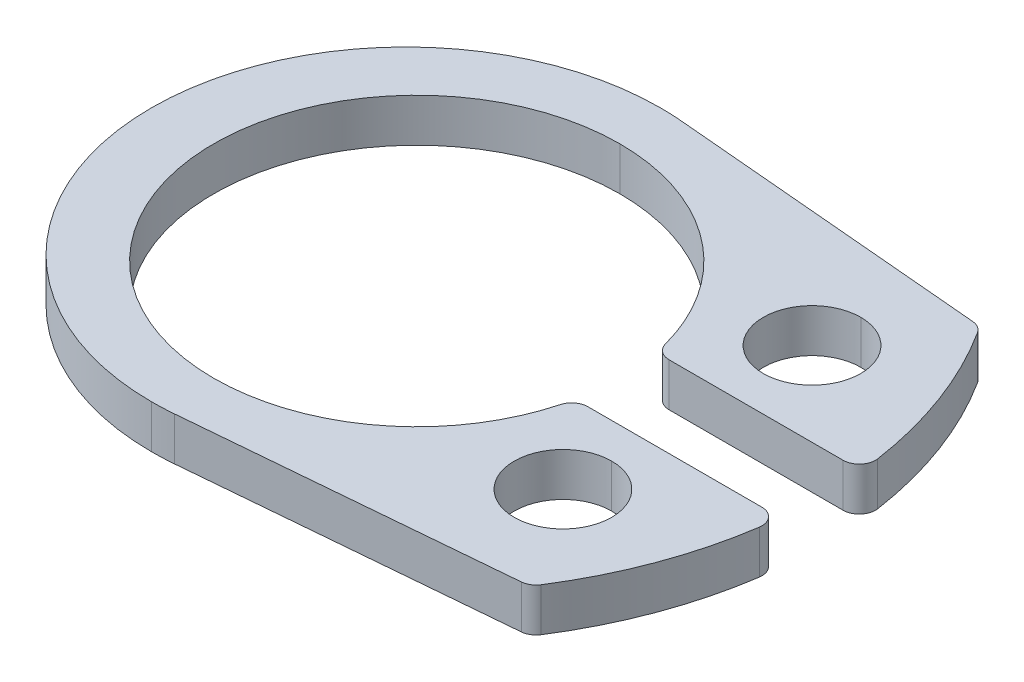
ISO-10303-21;
HEADER;
FILE_DESCRIPTION(('STEP AP214'),'2;1');
FILE_NAME('part.step','',(''),(''),'','','');
FILE_SCHEMA(('AUTOMOTIVE_DESIGN { 1 0 10303 214 1 1 1 1 }'));
ENDSEC;
DATA;
#1=APPLICATION_CONTEXT('core data for automotive mechanical design processes');
#2=APPLICATION_PROTOCOL_DEFINITION('international standard','automotive_design',2000,#1);
#3=PRODUCT_CONTEXT('',#1,'mechanical');
#4=PRODUCT('Part','Part','',(#3));
#5=PRODUCT_RELATED_PRODUCT_CATEGORY('part','',(#4));
#6=PRODUCT_DEFINITION_FORMATION('','',#4);
#7=PRODUCT_DEFINITION_CONTEXT('part definition',#1,'design');
#8=PRODUCT_DEFINITION('design','',#6,#7);
#9=PRODUCT_DEFINITION_SHAPE('','',#8);
#10=(LENGTH_UNIT() NAMED_UNIT(*) SI_UNIT(.MILLI.,.METRE.));
#11=(NAMED_UNIT(*) PLANE_ANGLE_UNIT() SI_UNIT($,.RADIAN.));
#12=(NAMED_UNIT(*) SI_UNIT($,.STERADIAN.) SOLID_ANGLE_UNIT());
#13=UNCERTAINTY_MEASURE_WITH_UNIT(LENGTH_MEASURE(1.E-05),#10,'distance_accuracy_value','');
#14=(GEOMETRIC_REPRESENTATION_CONTEXT(3) GLOBAL_UNCERTAINTY_ASSIGNED_CONTEXT((#13)) GLOBAL_UNIT_ASSIGNED_CONTEXT((#10,
#11,#12)) REPRESENTATION_CONTEXT('',''));
#15=CARTESIAN_POINT('',(0.,0.,0.));
#16=DIRECTION('',(0.,0.,1.));
#17=DIRECTION('',(1.,0.,0.));
#18=AXIS2_PLACEMENT_3D('',#15,#16,#17);
#19=CARTESIAN_POINT('',(7.12302604235026,0.8,-1.05));
#20=DIRECTION('',(0.,-1.,0.));
#21=DIRECTION('',(0.,0.,-1.));
#22=AXIS2_PLACEMENT_3D('',#19,#20,#21);
#23=CYLINDRICAL_SURFACE('',#22,0.3);
#24=CARTESIAN_POINT('',(7.12302604235026,0.8,-1.05));
#25=DIRECTION('',(0.,1.,0.));
#26=DIRECTION('',(0.,0.,1.));
#27=AXIS2_PLACEMENT_3D('',#24,#25,#26);
#28=CIRCLE('',#27,0.3);
#29=CARTESIAN_POINT('',(7.12302604235026,0.8,-0.75));
#30=VERTEX_POINT('',#29);
#31=CARTESIAN_POINT('',(7.41981879411485,0.8,-1.09375));
#32=VERTEX_POINT('',#31);
#33=EDGE_CURVE('E232',#30,#32,#28,.T.);
#34=ORIENTED_EDGE('',*,*,#33,.F.);
#35=DIRECTION('',(0.,1.,0.));
#36=VECTOR('',#35,1.);
#37=CARTESIAN_POINT('',(7.12302604235026,0.8,-0.75));
#38=LINE('',#37,#36);
#39=CARTESIAN_POINT('',(7.12302604235026,0.,-0.75));
#40=VERTEX_POINT('',#39);
#41=EDGE_CURVE('E248',#40,#30,#38,.T.);
#42=ORIENTED_EDGE('',*,*,#41,.F.);
#43=CARTESIAN_POINT('',(7.12302604235026,0.,-1.05));
#44=DIRECTION('',(0.,-1.,0.));
#45=DIRECTION('',(0.,0.,1.));
#46=AXIS2_PLACEMENT_3D('',#43,#44,#45);
#47=CIRCLE('',#46,0.3);
#48=CARTESIAN_POINT('',(7.41981879411485,0.,-1.09375));
#49=VERTEX_POINT('',#48);
#50=EDGE_CURVE('E306',#49,#40,#47,.T.);
#51=ORIENTED_EDGE('',*,*,#50,.F.);
#52=DIRECTION('',(0.,-1.,0.));
#53=VECTOR('',#52,1.);
#54=CARTESIAN_POINT('',(7.41981879411486,0.8,-1.09375));
#55=LINE('',#54,#53);
#56=EDGE_CURVE('E288',#32,#49,#55,.T.);
#57=ORIENTED_EDGE('',*,*,#56,.F.);
#58=EDGE_LOOP('',(#34,#42,#51,#57));
#59=FACE_BOUND('',#58,.T.);
#60=ADVANCED_FACE('F16',(#59),#23,.T.);
#61=CARTESIAN_POINT('',(6.07276609950572,0.8,3.86801136253425));
#62=DIRECTION('',(0.,-1.,0.));
#63=DIRECTION('',(0.,0.,-1.));
#64=AXIS2_PLACEMENT_3D('',#61,#62,#63);
#65=CYLINDRICAL_SURFACE('',#64,0.3);
#66=CARTESIAN_POINT('',(6.07276609950572,0.8,3.86801136253425));
#67=DIRECTION('',(0.,1.,0.));
#68=DIRECTION('',(0.,0.,1.));
#69=AXIS2_PLACEMENT_3D('',#66,#67,#68);
#70=CIRCLE('',#69,0.3);
#71=CARTESIAN_POINT('',(6.09891282233002,0.8,4.16686977196177));
#72=VERTEX_POINT('',#71);
#73=CARTESIAN_POINT('',(6.32579802031846,0.8,4.02917850263985));
#74=VERTEX_POINT('',#73);
#75=EDGE_CURVE('E281',#72,#74,#70,.T.);
#76=ORIENTED_EDGE('',*,*,#75,.F.);
#77=DIRECTION('',(0.,1.,0.));
#78=VECTOR('',#77,1.);
#79=CARTESIAN_POINT('',(6.09891282233002,0.8,4.16686977196177));
#80=LINE('',#79,#78);
#81=CARTESIAN_POINT('',(6.09891282233002,0.,4.16686977196177));
#82=VERTEX_POINT('',#81);
#83=EDGE_CURVE('E440',#82,#72,#80,.T.);
#84=ORIENTED_EDGE('',*,*,#83,.F.);
#85=CARTESIAN_POINT('',(6.07276609950572,0.,3.86801136253425));
#86=DIRECTION('',(0.,-1.,0.));
#87=DIRECTION('',(0.,0.,1.));
#88=AXIS2_PLACEMENT_3D('',#85,#86,#87);
#89=CIRCLE('',#88,0.3);
#90=CARTESIAN_POINT('',(6.32579802031846,0.,4.02917850263985));
#91=VERTEX_POINT('',#90);
#92=EDGE_CURVE('E338',#91,#82,#89,.T.);
#93=ORIENTED_EDGE('',*,*,#92,.F.);
#94=DIRECTION('',(0.,-1.,0.));
#95=VECTOR('',#94,1.);
#96=CARTESIAN_POINT('',(6.32579802031846,0.8,4.02917850263985));
#97=LINE('',#96,#95);
#98=EDGE_CURVE('E260',#74,#91,#97,.T.);
#99=ORIENTED_EDGE('',*,*,#98,.F.);
#100=EDGE_LOOP('',(#76,#84,#93,#99));
#101=FACE_BOUND('',#100,.T.);
#102=ADVANCED_FACE('F723',(#101),#65,.T.);
#103=CARTESIAN_POINT('',(7.12302604235026,0.8,1.05));
#104=DIRECTION('',(0.,-1.,0.));
#105=DIRECTION('',(0.,0.,-1.));
#106=AXIS2_PLACEMENT_3D('',#103,#104,#105);
#107=CYLINDRICAL_SURFACE('',#106,0.3);
#108=CARTESIAN_POINT('',(7.12302604235026,0.8,1.05));
#109=DIRECTION('',(0.,1.,0.));
#110=DIRECTION('',(0.,0.,1.));
#111=AXIS2_PLACEMENT_3D('',#108,#109,#110);
#112=CIRCLE('',#111,0.3);
#113=CARTESIAN_POINT('',(7.41981879411485,0.8,1.09375));
#114=VERTEX_POINT('',#113);
#115=CARTESIAN_POINT('',(7.12302604235026,0.8,0.75));
#116=VERTEX_POINT('',#115);
#117=EDGE_CURVE('E280',#114,#116,#112,.T.);
#118=ORIENTED_EDGE('',*,*,#117,.F.);
#119=DIRECTION('',(0.,1.,0.));
#120=VECTOR('',#119,1.);
#121=CARTESIAN_POINT('',(7.41981879411486,0.8,1.09375));
#122=LINE('',#121,#120);
#123=CARTESIAN_POINT('',(7.41981879411485,0.,1.09375));
#124=VERTEX_POINT('',#123);
#125=EDGE_CURVE('E276',#124,#114,#122,.T.);
#126=ORIENTED_EDGE('',*,*,#125,.F.);
#127=CARTESIAN_POINT('',(7.12302604235026,0.,1.05));
#128=DIRECTION('',(0.,-1.,0.));
#129=DIRECTION('',(0.,0.,1.));
#130=AXIS2_PLACEMENT_3D('',#127,#128,#129);
#131=CIRCLE('',#130,0.3);
#132=CARTESIAN_POINT('',(7.12302604235026,0.,0.75));
#133=VERTEX_POINT('',#132);
#134=EDGE_CURVE('E311',#133,#124,#131,.T.);
#135=ORIENTED_EDGE('',*,*,#134,.F.);
#136=DIRECTION('',(0.,-1.,0.));
#137=VECTOR('',#136,1.);
#138=CARTESIAN_POINT('',(7.12302604235026,0.8,0.75));
#139=LINE('',#138,#137);
#140=EDGE_CURVE('E318',#116,#133,#139,.T.);
#141=ORIENTED_EDGE('',*,*,#140,.F.);
#142=EDGE_LOOP('',(#118,#126,#135,#141));
#143=FACE_BOUND('',#142,.T.);
#144=ADVANCED_FACE('F727',(#143),#107,.T.);
#145=CARTESIAN_POINT('',(3.91152144312159,0.8,1.05));
#146=DIRECTION('',(0.,-1.,0.));
#147=DIRECTION('',(0.,0.,-1.));
#148=AXIS2_PLACEMENT_3D('',#145,#146,#147);
#149=CYLINDRICAL_SURFACE('',#148,0.3);
#150=CARTESIAN_POINT('',(3.91152144312159,0.8,1.05));
#151=DIRECTION('',(0.,1.,0.));
#152=DIRECTION('',(0.,0.,1.));
#153=AXIS2_PLACEMENT_3D('',#150,#151,#152);
#154=CIRCLE('',#153,0.3);
#155=CARTESIAN_POINT('',(3.91152144312159,0.8,0.75));
#156=VERTEX_POINT('',#155);
#157=CARTESIAN_POINT('',(3.62177911400147,0.8,0.972222222222222));
#158=VERTEX_POINT('',#157);
#159=EDGE_CURVE('E233',#156,#158,#154,.T.);
#160=ORIENTED_EDGE('',*,*,#159,.F.);
#161=DIRECTION('',(0.,1.,0.));
#162=VECTOR('',#161,1.);
#163=CARTESIAN_POINT('',(3.91152144312159,0.8,0.75));
#164=LINE('',#163,#162);
#165=CARTESIAN_POINT('',(3.91152144312159,0.,0.75));
#166=VERTEX_POINT('',#165);
#167=EDGE_CURVE('E378',#166,#156,#164,.T.);
#168=ORIENTED_EDGE('',*,*,#167,.F.);
#169=CARTESIAN_POINT('',(3.91152144312159,0.,1.05));
#170=DIRECTION('',(0.,-1.,0.));
#171=DIRECTION('',(0.,0.,1.));
#172=AXIS2_PLACEMENT_3D('',#169,#170,#171);
#173=CIRCLE('',#172,0.3);
#174=CARTESIAN_POINT('',(3.62177911400147,0.,0.972222222222222));
#175=VERTEX_POINT('',#174);
#176=EDGE_CURVE('E308',#175,#166,#173,.T.);
#177=ORIENTED_EDGE('',*,*,#176,.F.);
#178=DIRECTION('',(0.,-1.,0.));
#179=VECTOR('',#178,1.);
#180=CARTESIAN_POINT('',(3.62177911400147,0.8,0.972222222222222));
#181=LINE('',#180,#179);
#182=EDGE_CURVE('E256',#158,#175,#181,.T.);
#183=ORIENTED_EDGE('',*,*,#182,.F.);
#184=EDGE_LOOP('',(#160,#168,#177,#183));
#185=FACE_BOUND('',#184,.T.);
#186=ADVANCED_FACE('F797',(#185),#149,.T.);
#187=CARTESIAN_POINT('',(3.91152144312159,0.8,-1.05));
#188=DIRECTION('',(0.,-1.,0.));
#189=DIRECTION('',(0.,0.,-1.));
#190=AXIS2_PLACEMENT_3D('',#187,#188,#189);
#191=CYLINDRICAL_SURFACE('',#190,0.3);
#192=CARTESIAN_POINT('',(3.91152144312159,0.8,-1.05));
#193=DIRECTION('',(0.,1.,0.));
#194=DIRECTION('',(0.,0.,1.));
#195=AXIS2_PLACEMENT_3D('',#192,#193,#194);
#196=CIRCLE('',#195,0.3);
#197=CARTESIAN_POINT('',(3.62177911400147,0.8,-0.972222222222222));
#198=VERTEX_POINT('',#197);
#199=CARTESIAN_POINT('',(3.91152144312159,0.8,-0.75));
#200=VERTEX_POINT('',#199);
#201=EDGE_CURVE('E219',#198,#200,#196,.T.);
#202=ORIENTED_EDGE('',*,*,#201,.F.);
#203=DIRECTION('',(0.,1.,0.));
#204=VECTOR('',#203,1.);
#205=CARTESIAN_POINT('',(3.62177911400147,0.8,-0.972222222222222));
#206=LINE('',#205,#204);
#207=CARTESIAN_POINT('',(3.62177911400147,0.,-0.972222222222222));
#208=VERTEX_POINT('',#207);
#209=EDGE_CURVE('E415',#208,#198,#206,.T.);
#210=ORIENTED_EDGE('',*,*,#209,.F.);
#211=CARTESIAN_POINT('',(3.91152144312159,0.,-1.05));
#212=DIRECTION('',(0.,-1.,0.));
#213=DIRECTION('',(0.,0.,1.));
#214=AXIS2_PLACEMENT_3D('',#211,#212,#213);
#215=CIRCLE('',#214,0.3);
#216=CARTESIAN_POINT('',(3.91152144312159,0.,-0.75));
#217=VERTEX_POINT('',#216);
#218=EDGE_CURVE('E238',#217,#208,#215,.T.);
#219=ORIENTED_EDGE('',*,*,#218,.F.);
#220=DIRECTION('',(0.,-1.,0.));
#221=VECTOR('',#220,1.);
#222=CARTESIAN_POINT('',(3.91152144312159,0.8,-0.75));
#223=LINE('',#222,#221);
#224=EDGE_CURVE('E236',#200,#217,#223,.T.);
#225=ORIENTED_EDGE('',*,*,#224,.F.);
#226=EDGE_LOOP('',(#202,#210,#219,#225));
#227=FACE_BOUND('',#226,.T.);
#228=ADVANCED_FACE('F237',(#227),#191,.T.);
#229=CARTESIAN_POINT('',(6.07276609950572,0.8,-3.86801136253425));
#230=DIRECTION('',(0.,-1.,0.));
#231=DIRECTION('',(0.,0.,-1.));
#232=AXIS2_PLACEMENT_3D('',#229,#230,#231);
#233=CYLINDRICAL_SURFACE('',#232,0.3);
#234=CARTESIAN_POINT('',(6.07276609950572,0.8,-3.86801136253425));
#235=DIRECTION('',(0.,1.,0.));
#236=DIRECTION('',(0.,0.,1.));
#237=AXIS2_PLACEMENT_3D('',#234,#235,#236);
#238=CIRCLE('',#237,0.3);
#239=CARTESIAN_POINT('',(6.32579802031846,0.8,-4.02917850263985));
#240=VERTEX_POINT('',#239);
#241=CARTESIAN_POINT('',(6.09891282233002,0.8,-4.16686977196177));
#242=VERTEX_POINT('',#241);
#243=EDGE_CURVE('E284',#240,#242,#238,.T.);
#244=ORIENTED_EDGE('',*,*,#243,.F.);
#245=DIRECTION('',(0.,1.,0.));
#246=VECTOR('',#245,1.);
#247=CARTESIAN_POINT('',(6.32579802031846,0.8,-4.02917850263985));
#248=LINE('',#247,#246);
#249=CARTESIAN_POINT('',(6.32579802031846,0.,-4.02917850263985));
#250=VERTEX_POINT('',#249);
#251=EDGE_CURVE('E289',#250,#240,#248,.T.);
#252=ORIENTED_EDGE('',*,*,#251,.F.);
#253=CARTESIAN_POINT('',(6.07276609950572,0.,-3.86801136253425));
#254=DIRECTION('',(0.,-1.,0.));
#255=DIRECTION('',(0.,0.,1.));
#256=AXIS2_PLACEMENT_3D('',#253,#254,#255);
#257=CIRCLE('',#256,0.3);
#258=CARTESIAN_POINT('',(6.09891282233002,0.,-4.16686977196177));
#259=VERTEX_POINT('',#258);
#260=EDGE_CURVE('E41',#259,#250,#257,.T.);
#261=ORIENTED_EDGE('',*,*,#260,.F.);
#262=DIRECTION('',(0.,-1.,0.));
#263=VECTOR('',#262,1.);
#264=CARTESIAN_POINT('',(6.09891282233002,0.8,-4.16686977196177));
#265=LINE('',#264,#263);
#266=EDGE_CURVE('E292',#242,#259,#265,.T.);
#267=ORIENTED_EDGE('',*,*,#266,.F.);
#268=EDGE_LOOP('',(#244,#252,#261,#267));
#269=FACE_BOUND('',#268,.T.);
#270=ADVANCED_FACE('F472',(#269),#233,.T.);
#271=CARTESIAN_POINT('',(5.,0.8,-2.3));
#272=DIRECTION('',(0.,1.,0.));
#273=DIRECTION('',(0.,0.,1.));
#274=AXIS2_PLACEMENT_3D('',#271,#272,#273);
#275=CYLINDRICAL_SURFACE('',#274,0.9);
#276=DIRECTION('',(0.,1.,0.));
#277=VECTOR('',#276,1.);
#278=CARTESIAN_POINT('',(5.,0.8,-3.2));
#279=LINE('',#278,#277);
#280=CARTESIAN_POINT('',(5.,0.,-3.2));
#281=VERTEX_POINT('',#280);
#282=CARTESIAN_POINT('',(5.,0.8,-3.2));
#283=VERTEX_POINT('',#282);
#284=EDGE_CURVE('E271',#281,#283,#279,.T.);
#285=ORIENTED_EDGE('',*,*,#284,.F.);
#286=CARTESIAN_POINT('',(5.,0.,-2.3));
#287=DIRECTION('',(0.,1.,0.));
#288=DIRECTION('',(0.,0.,1.));
#289=AXIS2_PLACEMENT_3D('',#286,#287,#288);
#290=CIRCLE('',#289,0.9);
#291=CARTESIAN_POINT('',(5.,0.,-1.4));
#292=VERTEX_POINT('',#291);
#293=EDGE_CURVE('E27',#292,#281,#290,.T.);
#294=ORIENTED_EDGE('',*,*,#293,.F.);
#295=DIRECTION('',(0.,1.,0.));
#296=VECTOR('',#295,1.);
#297=CARTESIAN_POINT('',(5.,0.8,-1.4));
#298=LINE('',#297,#296);
#299=CARTESIAN_POINT('',(5.,0.8,-1.4));
#300=VERTEX_POINT('',#299);
#301=EDGE_CURVE('E270',#292,#300,#298,.T.);
#302=ORIENTED_EDGE('',*,*,#301,.T.);
#303=CARTESIAN_POINT('',(5.,0.8,-2.3));
#304=DIRECTION('',(0.,1.,0.));
#305=DIRECTION('',(0.,0.,1.));
#306=AXIS2_PLACEMENT_3D('',#303,#304,#305);
#307=CIRCLE('',#306,0.9);
#308=EDGE_CURVE('E326',#300,#283,#307,.T.);
#309=ORIENTED_EDGE('',*,*,#308,.T.);
#310=EDGE_LOOP('',(#285,#294,#302,#309));
#311=FACE_BOUND('',#310,.T.);
#312=ADVANCED_FACE('F688',(#311),#275,.F.);
#313=CARTESIAN_POINT('',(5.,0.8,2.3));
#314=DIRECTION('',(0.,1.,0.));
#315=DIRECTION('',(0.,0.,1.));
#316=AXIS2_PLACEMENT_3D('',#313,#314,#315);
#317=CYLINDRICAL_SURFACE('',#316,0.9);
#318=DIRECTION('',(0.,1.,0.));
#319=VECTOR('',#318,1.);
#320=CARTESIAN_POINT('',(5.,0.8,1.4));
#321=LINE('',#320,#319);
#322=CARTESIAN_POINT('',(5.,0.,1.4));
#323=VERTEX_POINT('',#322);
#324=CARTESIAN_POINT('',(5.,0.8,1.4));
#325=VERTEX_POINT('',#324);
#326=EDGE_CURVE('E335',#323,#325,#321,.T.);
#327=ORIENTED_EDGE('',*,*,#326,.F.);
#328=CARTESIAN_POINT('',(5.,0.,2.3));
#329=DIRECTION('',(0.,1.,0.));
#330=DIRECTION('',(0.,0.,1.));
#331=AXIS2_PLACEMENT_3D('',#328,#329,#330);
#332=CIRCLE('',#331,0.9);
#333=CARTESIAN_POINT('',(5.,0.,3.2));
#334=VERTEX_POINT('',#333);
#335=EDGE_CURVE('E11',#334,#323,#332,.T.);
#336=ORIENTED_EDGE('',*,*,#335,.F.);
#337=DIRECTION('',(0.,1.,0.));
#338=VECTOR('',#337,1.);
#339=CARTESIAN_POINT('',(5.,0.8,3.2));
#340=LINE('',#339,#338);
#341=CARTESIAN_POINT('',(5.,0.8,3.2));
#342=VERTEX_POINT('',#341);
#343=EDGE_CURVE('E334',#334,#342,#340,.T.);
#344=ORIENTED_EDGE('',*,*,#343,.T.);
#345=CARTESIAN_POINT('',(5.,0.8,2.3));
#346=DIRECTION('',(0.,1.,0.));
#347=DIRECTION('',(0.,0.,1.));
#348=AXIS2_PLACEMENT_3D('',#345,#346,#347);
#349=CIRCLE('',#348,0.9);
#350=EDGE_CURVE('E307',#342,#325,#349,.T.);
#351=ORIENTED_EDGE('',*,*,#350,.T.);
#352=EDGE_LOOP('',(#327,#336,#344,#351));
#353=FACE_BOUND('',#352,.T.);
#354=ADVANCED_FACE('F684',(#353),#317,.F.);
#355=CARTESIAN_POINT('',(-0.2,0.,0.));
#356=DIRECTION('',(0.,1.,0.));
#357=DIRECTION('',(1.,0.,0.));
#358=AXIS2_PLACEMENT_3D('',#355,#356,#357);
#359=PLANE('',#358);
#360=ORIENTED_EDGE('',*,*,#335,.T.);
#361=CARTESIAN_POINT('',(5.,0.,2.3));
#362=DIRECTION('',(0.,1.,0.));
#363=DIRECTION('',(0.,0.,1.));
#364=AXIS2_PLACEMENT_3D('',#361,#362,#363);
#365=CIRCLE('',#364,0.9);
#366=EDGE_CURVE('E360',#323,#334,#365,.T.);
#367=ORIENTED_EDGE('',*,*,#366,.T.);
#368=EDGE_LOOP('',(#360,#367));
#369=FACE_BOUND('',#368,.T.);
#370=ORIENTED_EDGE('',*,*,#293,.T.);
#371=CARTESIAN_POINT('',(5.,0.,-2.3));
#372=DIRECTION('',(0.,1.,0.));
#373=DIRECTION('',(0.,0.,1.));
#374=AXIS2_PLACEMENT_3D('',#371,#372,#373);
#375=CIRCLE('',#374,0.9);
#376=EDGE_CURVE('E382',#281,#292,#375,.T.);
#377=ORIENTED_EDGE('',*,*,#376,.T.);
#378=EDGE_LOOP('',(#370,#377));
#379=FACE_BOUND('',#378,.T.);
#380=DIRECTION('',(-0.996194698091746,0.,-0.0871557427476583));
#381=VECTOR('',#380,1.);
#382=CARTESIAN_POINT('',(0.209631990913994,0.,-4.68211508103121));
#383=LINE('',#382,#381);
#384=CARTESIAN_POINT('',(0.209631990913994,0.,-4.68211508103121));
#385=VERTEX_POINT('',#384);
#386=EDGE_CURVE('E290',#259,#385,#383,.T.);
#387=ORIENTED_EDGE('',*,*,#386,.F.);
#388=ORIENTED_EDGE('',*,*,#260,.T.);
#389=CARTESIAN_POINT('',(0.,0.,0.));
#390=DIRECTION('',(0.,1.,0.));
#391=DIRECTION('',(0.,0.,1.));
#392=AXIS2_PLACEMENT_3D('',#389,#390,#391);
#393=CIRCLE('',#392,7.5);
#394=EDGE_CURVE('E339',#49,#250,#393,.T.);
#395=ORIENTED_EDGE('',*,*,#394,.F.);
#396=ORIENTED_EDGE('',*,*,#50,.T.);
#397=DIRECTION('',(1.,0.,0.));
#398=VECTOR('',#397,1.);
#399=CARTESIAN_POINT('',(3.67423461417477,0.,-0.75));
#400=LINE('',#399,#398);
#401=EDGE_CURVE('E243',#217,#40,#400,.T.);
#402=ORIENTED_EDGE('',*,*,#401,.F.);
#403=ORIENTED_EDGE('',*,*,#218,.T.);
#404=CARTESIAN_POINT('',(0.,0.,0.));
#405=DIRECTION('',(0.,-1.,0.));
#406=DIRECTION('',(0.,0.,1.));
#407=AXIS2_PLACEMENT_3D('',#404,#405,#406);
#408=CIRCLE('',#407,3.75);
#409=CARTESIAN_POINT('',(0.,0.,-3.75));
#410=VERTEX_POINT('',#409);
#411=EDGE_CURVE('E388',#410,#208,#408,.T.);
#412=ORIENTED_EDGE('',*,*,#411,.F.);
#413=CARTESIAN_POINT('',(0.,0.,0.));
#414=DIRECTION('',(0.,-1.,0.));
#415=DIRECTION('',(0.,0.,1.));
#416=AXIS2_PLACEMENT_3D('',#413,#414,#415);
#417=CIRCLE('',#416,3.75);
#418=CARTESIAN_POINT('',(0.,0.,3.75));
#419=VERTEX_POINT('',#418);
#420=EDGE_CURVE('E355',#419,#410,#417,.T.);
#421=ORIENTED_EDGE('',*,*,#420,.F.);
#422=CARTESIAN_POINT('',(0.,0.,0.));
#423=DIRECTION('',(0.,-1.,0.));
#424=DIRECTION('',(0.,0.,1.));
#425=AXIS2_PLACEMENT_3D('',#422,#423,#424);
#426=CIRCLE('',#425,3.75);
#427=EDGE_CURVE('E250',#175,#419,#426,.T.);
#428=ORIENTED_EDGE('',*,*,#427,.F.);
#429=ORIENTED_EDGE('',*,*,#176,.T.);
#430=DIRECTION('',(-1.,0.,0.));
#431=VECTOR('',#430,1.);
#432=CARTESIAN_POINT('',(3.67423461417477,0.,0.75));
#433=LINE('',#432,#431);
#434=EDGE_CURVE('E264',#133,#166,#433,.T.);
#435=ORIENTED_EDGE('',*,*,#434,.F.);
#436=ORIENTED_EDGE('',*,*,#134,.T.);
#437=CARTESIAN_POINT('',(0.,0.,0.));
#438=DIRECTION('',(0.,1.,0.));
#439=DIRECTION('',(0.,0.,1.));
#440=AXIS2_PLACEMENT_3D('',#437,#438,#439);
#441=CIRCLE('',#440,7.5);
#442=EDGE_CURVE('E272',#91,#124,#441,.T.);
#443=ORIENTED_EDGE('',*,*,#442,.F.);
#444=ORIENTED_EDGE('',*,*,#92,.T.);
#445=DIRECTION('',(0.996194698091746,0.,-0.0871557427476583));
#446=VECTOR('',#445,1.);
#447=CARTESIAN_POINT('',(0.209631990913994,0.,4.68211508103121));
#448=LINE('',#447,#446);
#449=CARTESIAN_POINT('',(0.209631990913994,0.,4.68211508103121));
#450=VERTEX_POINT('',#449);
#451=EDGE_CURVE('E176',#450,#82,#448,.T.);
#452=ORIENTED_EDGE('',*,*,#451,.F.);
#453=CARTESIAN_POINT('',(-0.2,0.,0.));
#454=DIRECTION('',(0.,1.,0.));
#455=DIRECTION('',(0.,0.,1.));
#456=AXIS2_PLACEMENT_3D('',#453,#454,#455);
#457=CIRCLE('',#456,4.7);
#458=CARTESIAN_POINT('',(-0.2,0.,4.7));
#459=VERTEX_POINT('',#458);
#460=EDGE_CURVE('E316',#459,#450,#457,.T.);
#461=ORIENTED_EDGE('',*,*,#460,.F.);
#462=CARTESIAN_POINT('',(-0.2,0.,0.));
#463=DIRECTION('',(0.,1.,0.));
#464=DIRECTION('',(0.,0.,1.));
#465=AXIS2_PLACEMENT_3D('',#462,#463,#464);
#466=CIRCLE('',#465,4.7);
#467=CARTESIAN_POINT('',(-0.2,0.,-4.7));
#468=VERTEX_POINT('',#467);
#469=EDGE_CURVE('E163',#468,#459,#466,.T.);
#470=ORIENTED_EDGE('',*,*,#469,.F.);
#471=CARTESIAN_POINT('',(-0.2,0.,0.));
#472=DIRECTION('',(0.,1.,0.));
#473=DIRECTION('',(0.,0.,1.));
#474=AXIS2_PLACEMENT_3D('',#471,#472,#473);
#475=CIRCLE('',#474,4.7);
#476=EDGE_CURVE('E20',#385,#468,#475,.T.);
#477=ORIENTED_EDGE('',*,*,#476,.F.);
#478=EDGE_LOOP('',(#387,#388,#395,#396,#402,#403,#412,#421,#428,#429,#435,#436,#443,#444,#452,
#461,#470,#477));
#479=FACE_BOUND('',#478,.T.);
#480=ADVANCED_FACE('F457',(#369,#379,#479),#359,.F.);
#481=CARTESIAN_POINT('',(-0.2,0.8,0.));
#482=DIRECTION('',(0.,1.,0.));
#483=DIRECTION('',(1.,0.,0.));
#484=AXIS2_PLACEMENT_3D('',#481,#482,#483);
#485=PLANE('',#484);
#486=ORIENTED_EDGE('',*,*,#350,.F.);
#487=CARTESIAN_POINT('',(5.,0.8,2.3));
#488=DIRECTION('',(0.,1.,0.));
#489=DIRECTION('',(0.,0.,1.));
#490=AXIS2_PLACEMENT_3D('',#487,#488,#489);
#491=CIRCLE('',#490,0.9);
#492=EDGE_CURVE('E330',#325,#342,#491,.T.);
#493=ORIENTED_EDGE('',*,*,#492,.F.);
#494=EDGE_LOOP('',(#486,#493));
#495=FACE_BOUND('',#494,.T.);
#496=ORIENTED_EDGE('',*,*,#308,.F.);
#497=CARTESIAN_POINT('',(5.,0.8,-2.3));
#498=DIRECTION('',(0.,1.,0.));
#499=DIRECTION('',(0.,0.,1.));
#500=AXIS2_PLACEMENT_3D('',#497,#498,#499);
#501=CIRCLE('',#500,0.9);
#502=EDGE_CURVE('E266',#283,#300,#501,.T.);
#503=ORIENTED_EDGE('',*,*,#502,.F.);
#504=EDGE_LOOP('',(#496,#503));
#505=FACE_BOUND('',#504,.T.);
#506=CARTESIAN_POINT('',(0.,0.8,0.));
#507=DIRECTION('',(0.,1.,0.));
#508=DIRECTION('',(0.,0.,1.));
#509=AXIS2_PLACEMENT_3D('',#506,#507,#508);
#510=CIRCLE('',#509,7.5);
#511=EDGE_CURVE('E285',#32,#240,#510,.T.);
#512=ORIENTED_EDGE('',*,*,#511,.T.);
#513=ORIENTED_EDGE('',*,*,#243,.T.);
#514=DIRECTION('',(-0.996194698091746,0.,-0.0871557427476583));
#515=VECTOR('',#514,1.);
#516=CARTESIAN_POINT('',(0.209631990913994,0.8,-4.68211508103121));
#517=LINE('',#516,#515);
#518=CARTESIAN_POINT('',(0.209631990913994,0.8,-4.68211508103121));
#519=VERTEX_POINT('',#518);
#520=EDGE_CURVE('E426',#242,#519,#517,.T.);
#521=ORIENTED_EDGE('',*,*,#520,.T.);
#522=CARTESIAN_POINT('',(-0.2,0.8,0.));
#523=DIRECTION('',(0.,1.,0.));
#524=DIRECTION('',(0.,0.,1.));
#525=AXIS2_PLACEMENT_3D('',#522,#523,#524);
#526=CIRCLE('',#525,4.7);
#527=CARTESIAN_POINT('',(-0.2,0.8,-4.7));
#528=VERTEX_POINT('',#527);
#529=EDGE_CURVE('E371',#519,#528,#526,.T.);
#530=ORIENTED_EDGE('',*,*,#529,.T.);
#531=CARTESIAN_POINT('',(-0.2,0.8,0.));
#532=DIRECTION('',(0.,1.,0.));
#533=DIRECTION('',(0.,0.,1.));
#534=AXIS2_PLACEMENT_3D('',#531,#532,#533);
#535=CIRCLE('',#534,4.7);
#536=CARTESIAN_POINT('',(-0.2,0.8,4.7));
#537=VERTEX_POINT('',#536);
#538=EDGE_CURVE('E294',#528,#537,#535,.T.);
#539=ORIENTED_EDGE('',*,*,#538,.T.);
#540=CARTESIAN_POINT('',(-0.2,0.8,0.));
#541=DIRECTION('',(0.,1.,0.));
#542=DIRECTION('',(0.,0.,1.));
#543=AXIS2_PLACEMENT_3D('',#540,#541,#542);
#544=CIRCLE('',#543,4.7);
#545=CARTESIAN_POINT('',(0.209631990913994,0.8,4.68211508103121));
#546=VERTEX_POINT('',#545);
#547=EDGE_CURVE('E317',#537,#546,#544,.T.);
#548=ORIENTED_EDGE('',*,*,#547,.T.);
#549=DIRECTION('',(0.996194698091746,0.,-0.0871557427476583));
#550=VECTOR('',#549,1.);
#551=CARTESIAN_POINT('',(0.209631990913994,0.8,4.68211508103121));
#552=LINE('',#551,#550);
#553=EDGE_CURVE('E277',#546,#72,#552,.T.);
#554=ORIENTED_EDGE('',*,*,#553,.T.);
#555=ORIENTED_EDGE('',*,*,#75,.T.);
#556=CARTESIAN_POINT('',(0.,0.8,0.));
#557=DIRECTION('',(0.,1.,0.));
#558=DIRECTION('',(0.,0.,1.));
#559=AXIS2_PLACEMENT_3D('',#556,#557,#558);
#560=CIRCLE('',#559,7.5);
#561=EDGE_CURVE('E265',#74,#114,#560,.T.);
#562=ORIENTED_EDGE('',*,*,#561,.T.);
#563=ORIENTED_EDGE('',*,*,#117,.T.);
#564=DIRECTION('',(-1.,0.,0.));
#565=VECTOR('',#564,1.);
#566=CARTESIAN_POINT('',(3.67423461417477,0.8,0.75));
#567=LINE('',#566,#565);
#568=EDGE_CURVE('E323',#116,#156,#567,.T.);
#569=ORIENTED_EDGE('',*,*,#568,.T.);
#570=ORIENTED_EDGE('',*,*,#159,.T.);
#571=CARTESIAN_POINT('',(0.,0.8,0.));
#572=DIRECTION('',(0.,-1.,0.));
#573=DIRECTION('',(0.,0.,1.));
#574=AXIS2_PLACEMENT_3D('',#571,#572,#573);
#575=CIRCLE('',#574,3.75);
#576=CARTESIAN_POINT('',(0.,0.8,3.75));
#577=VERTEX_POINT('',#576);
#578=EDGE_CURVE('E322',#158,#577,#575,.T.);
#579=ORIENTED_EDGE('',*,*,#578,.T.);
#580=CARTESIAN_POINT('',(0.,0.8,0.));
#581=DIRECTION('',(0.,-1.,0.));
#582=DIRECTION('',(0.,0.,1.));
#583=AXIS2_PLACEMENT_3D('',#580,#581,#582);
#584=CIRCLE('',#583,3.75);
#585=CARTESIAN_POINT('',(0.,0.8,-3.75));
#586=VERTEX_POINT('',#585);
#587=EDGE_CURVE('E356',#577,#586,#584,.T.);
#588=ORIENTED_EDGE('',*,*,#587,.T.);
#589=CARTESIAN_POINT('',(0.,0.8,0.));
#590=DIRECTION('',(0.,-1.,0.));
#591=DIRECTION('',(0.,0.,1.));
#592=AXIS2_PLACEMENT_3D('',#589,#590,#591);
#593=CIRCLE('',#592,3.75);
#594=EDGE_CURVE('E227',#586,#198,#593,.T.);
#595=ORIENTED_EDGE('',*,*,#594,.T.);
#596=ORIENTED_EDGE('',*,*,#201,.T.);
#597=DIRECTION('',(1.,0.,0.));
#598=VECTOR('',#597,1.);
#599=CARTESIAN_POINT('',(3.67423461417477,0.8,-0.75));
#600=LINE('',#599,#598);
#601=EDGE_CURVE('E224',#200,#30,#600,.T.);
#602=ORIENTED_EDGE('',*,*,#601,.T.);
#603=ORIENTED_EDGE('',*,*,#33,.T.);
#604=EDGE_LOOP('',(#512,#513,#521,#530,#539,#548,#554,#555,#562,#563,#569,#570,#579,#588,#595,
#596,#602,#603));
#605=FACE_BOUND('',#604,.T.);
#606=ADVANCED_FACE('F222',(#495,#505,#605),#485,.T.);
#607=CARTESIAN_POINT('',(0.209631990913994,0.8,-4.68211508103121));
#608=DIRECTION('',(-0.0871557427476583,0.,0.996194698091746));
#609=DIRECTION('',(0.,1.,0.));
#610=AXIS2_PLACEMENT_3D('',#607,#608,#609);
#611=PLANE('',#610);
#612=ORIENTED_EDGE('',*,*,#520,.F.);
#613=ORIENTED_EDGE('',*,*,#266,.T.);
#614=ORIENTED_EDGE('',*,*,#386,.T.);
#615=DIRECTION('',(0.,-1.,0.));
#616=VECTOR('',#615,1.);
#617=CARTESIAN_POINT('',(0.209631990913994,0.8,-4.68211508103121));
#618=LINE('',#617,#616);
#619=EDGE_CURVE('E374',#519,#385,#618,.T.);
#620=ORIENTED_EDGE('',*,*,#619,.F.);
#621=EDGE_LOOP('',(#612,#613,#614,#620));
#622=FACE_BOUND('',#621,.T.);
#623=ADVANCED_FACE('F470',(#622),#611,.F.);
#624=CARTESIAN_POINT('',(0.,0.8,0.));
#625=DIRECTION('',(0.,-1.,0.));
#626=DIRECTION('',(0.,0.,-1.));
#627=AXIS2_PLACEMENT_3D('',#624,#625,#626);
#628=CYLINDRICAL_SURFACE('',#627,7.5);
#629=ORIENTED_EDGE('',*,*,#394,.T.);
#630=ORIENTED_EDGE('',*,*,#251,.T.);
#631=ORIENTED_EDGE('',*,*,#511,.F.);
#632=ORIENTED_EDGE('',*,*,#56,.T.);
#633=EDGE_LOOP('',(#629,#630,#631,#632));
#634=FACE_BOUND('',#633,.T.);
#635=ADVANCED_FACE('F18',(#634),#628,.T.);
#636=CARTESIAN_POINT('',(3.67423461417477,0.8,-0.75));
#637=DIRECTION('',(0.,0.,-1.));
#638=DIRECTION('',(0.,-1.,0.));
#639=AXIS2_PLACEMENT_3D('',#636,#637,#638);
#640=PLANE('',#639);
#641=ORIENTED_EDGE('',*,*,#601,.F.);
#642=ORIENTED_EDGE('',*,*,#224,.T.);
#643=ORIENTED_EDGE('',*,*,#401,.T.);
#644=ORIENTED_EDGE('',*,*,#41,.T.);
#645=EDGE_LOOP('',(#641,#642,#643,#644));
#646=FACE_BOUND('',#645,.T.);
#647=ADVANCED_FACE('F246',(#646),#640,.F.);
#648=CARTESIAN_POINT('',(0.,0.8,0.));
#649=DIRECTION('',(0.,-1.,0.));
#650=DIRECTION('',(0.,0.,-1.));
#651=AXIS2_PLACEMENT_3D('',#648,#649,#650);
#652=CYLINDRICAL_SURFACE('',#651,3.75);
#653=DIRECTION('',(0.,-1.,0.));
#654=VECTOR('',#653,1.);
#655=CARTESIAN_POINT('',(0.,0.8,3.75));
#656=LINE('',#655,#654);
#657=EDGE_CURVE('E351',#577,#419,#656,.T.);
#658=ORIENTED_EDGE('',*,*,#657,.F.);
#659=ORIENTED_EDGE('',*,*,#578,.F.);
#660=ORIENTED_EDGE('',*,*,#182,.T.);
#661=ORIENTED_EDGE('',*,*,#427,.T.);
#662=EDGE_LOOP('',(#658,#659,#660,#661));
#663=FACE_BOUND('',#662,.T.);
#664=ADVANCED_FACE('F493',(#663),#652,.F.);
#665=CARTESIAN_POINT('',(3.67423461417477,0.8,0.75));
#666=DIRECTION('',(0.,0.,1.));
#667=DIRECTION('',(1.,0.,0.));
#668=AXIS2_PLACEMENT_3D('',#665,#666,#667);
#669=PLANE('',#668);
#670=ORIENTED_EDGE('',*,*,#434,.T.);
#671=ORIENTED_EDGE('',*,*,#167,.T.);
#672=ORIENTED_EDGE('',*,*,#568,.F.);
#673=ORIENTED_EDGE('',*,*,#140,.T.);
#674=EDGE_LOOP('',(#670,#671,#672,#673));
#675=FACE_BOUND('',#674,.T.);
#676=ADVANCED_FACE('F667',(#675),#669,.F.);
#677=CARTESIAN_POINT('',(0.,0.8,0.));
#678=DIRECTION('',(0.,-1.,0.));
#679=DIRECTION('',(0.,0.,-1.));
#680=AXIS2_PLACEMENT_3D('',#677,#678,#679);
#681=CYLINDRICAL_SURFACE('',#680,7.5);
#682=ORIENTED_EDGE('',*,*,#442,.T.);
#683=ORIENTED_EDGE('',*,*,#125,.T.);
#684=ORIENTED_EDGE('',*,*,#561,.F.);
#685=ORIENTED_EDGE('',*,*,#98,.T.);
#686=EDGE_LOOP('',(#682,#683,#684,#685));
#687=FACE_BOUND('',#686,.T.);
#688=ADVANCED_FACE('F662',(#687),#681,.T.);
#689=CARTESIAN_POINT('',(0.209631990913994,0.8,4.68211508103121));
#690=DIRECTION('',(-0.0871557427476583,0.,-0.996194698091746));
#691=DIRECTION('',(-0.996194698091746,0.,0.0871557427476583));
#692=AXIS2_PLACEMENT_3D('',#689,#690,#691);
#693=PLANE('',#692);
#694=ORIENTED_EDGE('',*,*,#451,.T.);
#695=ORIENTED_EDGE('',*,*,#83,.T.);
#696=ORIENTED_EDGE('',*,*,#553,.F.);
#697=DIRECTION('',(0.,-1.,0.));
#698=VECTOR('',#697,1.);
#699=CARTESIAN_POINT('',(0.209631990913994,0.8,4.68211508103121));
#700=LINE('',#699,#698);
#701=EDGE_CURVE('E298',#546,#450,#700,.T.);
#702=ORIENTED_EDGE('',*,*,#701,.T.);
#703=EDGE_LOOP('',(#694,#695,#696,#702));
#704=FACE_BOUND('',#703,.T.);
#705=ADVANCED_FACE('F666',(#704),#693,.F.);
#706=CARTESIAN_POINT('',(-0.2,0.8,0.));
#707=DIRECTION('',(0.,-1.,0.));
#708=DIRECTION('',(0.,0.,-1.));
#709=AXIS2_PLACEMENT_3D('',#706,#707,#708);
#710=CYLINDRICAL_SURFACE('',#709,4.7);
#711=DIRECTION('',(0.,-1.,0.));
#712=VECTOR('',#711,1.);
#713=CARTESIAN_POINT('',(-0.2,0.8,-4.7));
#714=LINE('',#713,#712);
#715=EDGE_CURVE('E297',#528,#468,#714,.T.);
#716=ORIENTED_EDGE('',*,*,#715,.F.);
#717=ORIENTED_EDGE('',*,*,#529,.F.);
#718=ORIENTED_EDGE('',*,*,#619,.T.);
#719=ORIENTED_EDGE('',*,*,#476,.T.);
#720=EDGE_LOOP('',(#716,#717,#718,#719));
#721=FACE_BOUND('',#720,.T.);
#722=ADVANCED_FACE('F453',(#721),#710,.T.);
#723=CARTESIAN_POINT('',(-0.2,0.8,0.));
#724=DIRECTION('',(0.,-1.,0.));
#725=DIRECTION('',(0.,0.,-1.));
#726=AXIS2_PLACEMENT_3D('',#723,#724,#725);
#727=CYLINDRICAL_SURFACE('',#726,4.7);
#728=DIRECTION('',(0.,-1.,0.));
#729=VECTOR('',#728,1.);
#730=CARTESIAN_POINT('',(-0.2,0.8,4.7));
#731=LINE('',#730,#729);
#732=EDGE_CURVE('E312',#537,#459,#731,.T.);
#733=ORIENTED_EDGE('',*,*,#732,.F.);
#734=ORIENTED_EDGE('',*,*,#538,.F.);
#735=ORIENTED_EDGE('',*,*,#715,.T.);
#736=ORIENTED_EDGE('',*,*,#469,.T.);
#737=EDGE_LOOP('',(#733,#734,#735,#736));
#738=FACE_BOUND('',#737,.T.);
#739=ADVANCED_FACE('F461',(#738),#727,.T.);
#740=CARTESIAN_POINT('',(-0.2,0.8,0.));
#741=DIRECTION('',(0.,-1.,0.));
#742=DIRECTION('',(0.,0.,-1.));
#743=AXIS2_PLACEMENT_3D('',#740,#741,#742);
#744=CYLINDRICAL_SURFACE('',#743,4.7);
#745=ORIENTED_EDGE('',*,*,#547,.F.);
#746=ORIENTED_EDGE('',*,*,#732,.T.);
#747=ORIENTED_EDGE('',*,*,#460,.T.);
#748=ORIENTED_EDGE('',*,*,#701,.F.);
#749=EDGE_LOOP('',(#745,#746,#747,#748));
#750=FACE_BOUND('',#749,.T.);
#751=ADVANCED_FACE('F654',(#750),#744,.T.);
#752=CARTESIAN_POINT('',(0.,0.8,0.));
#753=DIRECTION('',(0.,-1.,0.));
#754=DIRECTION('',(0.,0.,-1.));
#755=AXIS2_PLACEMENT_3D('',#752,#753,#754);
#756=CYLINDRICAL_SURFACE('',#755,3.75);
#757=ORIENTED_EDGE('',*,*,#594,.F.);
#758=DIRECTION('',(0.,-1.,0.));
#759=VECTOR('',#758,1.);
#760=CARTESIAN_POINT('',(0.,0.8,-3.75));
#761=LINE('',#760,#759);
#762=EDGE_CURVE('E389',#586,#410,#761,.T.);
#763=ORIENTED_EDGE('',*,*,#762,.T.);
#764=ORIENTED_EDGE('',*,*,#411,.T.);
#765=ORIENTED_EDGE('',*,*,#209,.T.);
#766=EDGE_LOOP('',(#757,#763,#764,#765));
#767=FACE_BOUND('',#766,.T.);
#768=ADVANCED_FACE('F481',(#767),#756,.F.);
#769=CARTESIAN_POINT('',(0.,0.8,0.));
#770=DIRECTION('',(0.,-1.,0.));
#771=DIRECTION('',(0.,0.,-1.));
#772=AXIS2_PLACEMENT_3D('',#769,#770,#771);
#773=CYLINDRICAL_SURFACE('',#772,3.75);
#774=ORIENTED_EDGE('',*,*,#587,.F.);
#775=ORIENTED_EDGE('',*,*,#657,.T.);
#776=ORIENTED_EDGE('',*,*,#420,.T.);
#777=ORIENTED_EDGE('',*,*,#762,.F.);
#778=EDGE_LOOP('',(#774,#775,#776,#777));
#779=FACE_BOUND('',#778,.T.);
#780=ADVANCED_FACE('F484',(#779),#773,.F.);
#781=CARTESIAN_POINT('',(5.,0.8,2.3));
#782=DIRECTION('',(0.,1.,0.));
#783=DIRECTION('',(0.,0.,1.));
#784=AXIS2_PLACEMENT_3D('',#781,#782,#783);
#785=CYLINDRICAL_SURFACE('',#784,0.9);
#786=ORIENTED_EDGE('',*,*,#366,.F.);
#787=ORIENTED_EDGE('',*,*,#326,.T.);
#788=ORIENTED_EDGE('',*,*,#492,.T.);
#789=ORIENTED_EDGE('',*,*,#343,.F.);
#790=EDGE_LOOP('',(#786,#787,#788,#789));
#791=FACE_BOUND('',#790,.T.);
#792=ADVANCED_FACE('F776',(#791),#785,.F.);
#793=CARTESIAN_POINT('',(5.,0.8,-2.3));
#794=DIRECTION('',(0.,1.,0.));
#795=DIRECTION('',(0.,0.,1.));
#796=AXIS2_PLACEMENT_3D('',#793,#794,#795);
#797=CYLINDRICAL_SURFACE('',#796,0.9);
#798=ORIENTED_EDGE('',*,*,#376,.F.);
#799=ORIENTED_EDGE('',*,*,#284,.T.);
#800=ORIENTED_EDGE('',*,*,#502,.T.);
#801=ORIENTED_EDGE('',*,*,#301,.F.);
#802=EDGE_LOOP('',(#798,#799,#800,#801));
#803=FACE_BOUND('',#802,.T.);
#804=ADVANCED_FACE('F783',(#803),#797,.F.);
#805=CLOSED_SHELL('',(#60,#102,#144,#186,#228,#270,#312,#354,#480,#606,#623,#635,#647,#664,#676,
#688,#705,#722,#739,#751,#768,#780,#792,#804));
#806=MANIFOLD_SOLID_BREP('B1',#805);
#807=ADVANCED_BREP_SHAPE_REPRESENTATION('',(#18,#806),#14);
#808=SHAPE_DEFINITION_REPRESENTATION(#9,#807);
ENDSEC;
END-ISO-10303-21;
